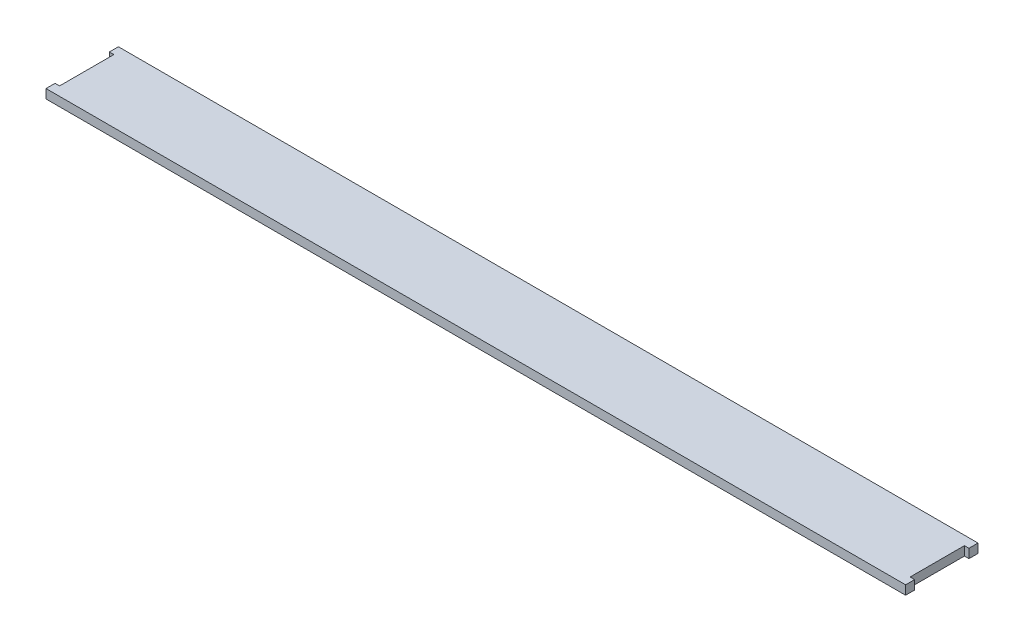
ISO-10303-21;
HEADER;
FILE_DESCRIPTION(('STEP AP214'),'2;1');
FILE_NAME('part.step','',(''),(''),'','','');
FILE_SCHEMA(('AUTOMOTIVE_DESIGN { 1 0 10303 214 1 1 1 1 }'));
ENDSEC;
DATA;
#1=APPLICATION_CONTEXT('core data for automotive mechanical design processes');
#2=APPLICATION_PROTOCOL_DEFINITION('international standard','automotive_design',2000,#1);
#3=PRODUCT_CONTEXT('',#1,'mechanical');
#4=PRODUCT('Part','Part','',(#3));
#5=PRODUCT_RELATED_PRODUCT_CATEGORY('part','',(#4));
#6=PRODUCT_DEFINITION_FORMATION('','',#4);
#7=PRODUCT_DEFINITION_CONTEXT('part definition',#1,'design');
#8=PRODUCT_DEFINITION('design','',#6,#7);
#9=PRODUCT_DEFINITION_SHAPE('','',#8);
#10=(LENGTH_UNIT() NAMED_UNIT(*) SI_UNIT(.MILLI.,.METRE.));
#11=(NAMED_UNIT(*) PLANE_ANGLE_UNIT() SI_UNIT($,.RADIAN.));
#12=(NAMED_UNIT(*) SI_UNIT($,.STERADIAN.) SOLID_ANGLE_UNIT());
#13=UNCERTAINTY_MEASURE_WITH_UNIT(LENGTH_MEASURE(1.E-05),#10,'distance_accuracy_value','');
#14=(GEOMETRIC_REPRESENTATION_CONTEXT(3) GLOBAL_UNCERTAINTY_ASSIGNED_CONTEXT((#13)) GLOBAL_UNIT_ASSIGNED_CONTEXT((#10,
#11,#12)) REPRESENTATION_CONTEXT('',''));
#15=CARTESIAN_POINT('',(0.,0.,0.));
#16=DIRECTION('',(0.,0.,1.));
#17=DIRECTION('',(1.,0.,0.));
#18=AXIS2_PLACEMENT_3D('',#15,#16,#17);
#19=CARTESIAN_POINT('',(301.625,6.35,-28.1614592723087));
#20=DIRECTION('',(-1.,0.,0.));
#21=DIRECTION('',(0.,0.,1.));
#22=AXIS2_PLACEMENT_3D('',#19,#20,#21);
#23=PLANE('',#22);
#24=DIRECTION('',(0.,0.,-1.));
#25=VECTOR('',#24,1.);
#26=CARTESIAN_POINT('',(301.625,0.,-28.1614592723087));
#27=LINE('',#26,#25);
#28=CARTESIAN_POINT('',(301.625,0.,-21.8114592723087));
#29=VERTEX_POINT('',#28);
#30=CARTESIAN_POINT('',(301.625,0.,-28.1614592723087));
#31=VERTEX_POINT('',#30);
#32=EDGE_CURVE('E152',#29,#31,#27,.T.);
#33=ORIENTED_EDGE('',*,*,#32,.T.);
#34=DIRECTION('',(0.,-1.,0.));
#35=VECTOR('',#34,1.);
#36=CARTESIAN_POINT('',(301.625,6.35,-28.1614592723087));
#37=LINE('',#36,#35);
#38=CARTESIAN_POINT('',(301.625,6.35,-28.1614592723087));
#39=VERTEX_POINT('',#38);
#40=EDGE_CURVE('E11',#39,#31,#37,.T.);
#41=ORIENTED_EDGE('',*,*,#40,.F.);
#42=DIRECTION('',(0.,0.,-1.));
#43=VECTOR('',#42,1.);
#44=CARTESIAN_POINT('',(301.625,6.35,-28.1614592723087));
#45=LINE('',#44,#43);
#46=CARTESIAN_POINT('',(301.625,6.35,-21.8114592723087));
#47=VERTEX_POINT('',#46);
#48=EDGE_CURVE('E174',#47,#39,#45,.T.);
#49=ORIENTED_EDGE('',*,*,#48,.F.);
#50=DIRECTION('',(0.,-1.,0.));
#51=VECTOR('',#50,1.);
#52=CARTESIAN_POINT('',(301.625,6.35,-21.8114592723087));
#53=LINE('',#52,#51);
#54=EDGE_CURVE('E148',#47,#29,#53,.T.);
#55=ORIENTED_EDGE('',*,*,#54,.T.);
#56=EDGE_LOOP('',(#33,#41,#49,#55));
#57=FACE_BOUND('',#56,.T.);
#58=ADVANCED_FACE('F32',(#57),#23,.F.);
#59=CARTESIAN_POINT('',(301.625,6.35,-28.1614592723087));
#60=DIRECTION('',(0.,0.,1.));
#61=DIRECTION('',(1.,0.,0.));
#62=AXIS2_PLACEMENT_3D('',#59,#60,#61);
#63=PLANE('',#62);
#64=DIRECTION('',(-1.,0.,0.));
#65=VECTOR('',#64,1.);
#66=CARTESIAN_POINT('',(301.625,0.,-28.1614592723087));
#67=LINE('',#66,#65);
#68=CARTESIAN_POINT('',(-301.625,0.,-28.1614592723086));
#69=VERTEX_POINT('',#68);
#70=EDGE_CURVE('E155',#31,#69,#67,.T.);
#71=ORIENTED_EDGE('',*,*,#70,.T.);
#72=DIRECTION('',(0.,-1.,0.));
#73=VECTOR('',#72,1.);
#74=CARTESIAN_POINT('',(-301.625,6.35,-28.1614592723086));
#75=LINE('',#74,#73);
#76=CARTESIAN_POINT('',(-301.625,6.35,-28.1614592723086));
#77=VERTEX_POINT('',#76);
#78=EDGE_CURVE('E40',#77,#69,#75,.T.);
#79=ORIENTED_EDGE('',*,*,#78,.F.);
#80=DIRECTION('',(-1.,0.,0.));
#81=VECTOR('',#80,1.);
#82=CARTESIAN_POINT('',(301.625,6.35,-28.1614592723087));
#83=LINE('',#82,#81);
#84=EDGE_CURVE('E103',#39,#77,#83,.T.);
#85=ORIENTED_EDGE('',*,*,#84,.F.);
#86=ORIENTED_EDGE('',*,*,#40,.T.);
#87=EDGE_LOOP('',(#71,#79,#85,#86));
#88=FACE_BOUND('',#87,.T.);
#89=ADVANCED_FACE('F252',(#88),#63,.F.);
#90=CARTESIAN_POINT('',(-301.625,6.35,-28.1614592723086));
#91=DIRECTION('',(1.,0.,0.));
#92=DIRECTION('',(0.,0.,-1.));
#93=AXIS2_PLACEMENT_3D('',#90,#91,#92);
#94=PLANE('',#93);
#95=DIRECTION('',(0.,0.,1.));
#96=VECTOR('',#95,1.);
#97=CARTESIAN_POINT('',(-301.625,0.,-28.1614592723086));
#98=LINE('',#97,#96);
#99=CARTESIAN_POINT('',(-301.625,0.,-21.8114592723086));
#100=VERTEX_POINT('',#99);
#101=EDGE_CURVE('E157',#69,#100,#98,.T.);
#102=ORIENTED_EDGE('',*,*,#101,.T.);
#103=DIRECTION('',(0.,-1.,0.));
#104=VECTOR('',#103,1.);
#105=CARTESIAN_POINT('',(-301.625,6.35,-21.8114592723086));
#106=LINE('',#105,#104);
#107=CARTESIAN_POINT('',(-301.625,6.35,-21.8114592723086));
#108=VERTEX_POINT('',#107);
#109=EDGE_CURVE('E193',#108,#100,#106,.T.);
#110=ORIENTED_EDGE('',*,*,#109,.F.);
#111=DIRECTION('',(0.,0.,1.));
#112=VECTOR('',#111,1.);
#113=CARTESIAN_POINT('',(-301.625,6.35,-28.1614592723086));
#114=LINE('',#113,#112);
#115=EDGE_CURVE('E201',#77,#108,#114,.T.);
#116=ORIENTED_EDGE('',*,*,#115,.F.);
#117=ORIENTED_EDGE('',*,*,#78,.T.);
#118=EDGE_LOOP('',(#102,#110,#116,#117));
#119=FACE_BOUND('',#118,.T.);
#120=ADVANCED_FACE('F199',(#119),#94,.F.);
#121=CARTESIAN_POINT('',(-301.625,6.35,-21.8114592723086));
#122=DIRECTION('',(0.,0.,-1.));
#123=DIRECTION('',(-1.,0.,0.));
#124=AXIS2_PLACEMENT_3D('',#121,#122,#123);
#125=PLANE('',#124);
#126=DIRECTION('',(1.,0.,0.));
#127=VECTOR('',#126,1.);
#128=CARTESIAN_POINT('',(-301.625,0.,-21.8114592723086));
#129=LINE('',#128,#127);
#130=CARTESIAN_POINT('',(-298.45,0.,-21.8114592723086));
#131=VERTEX_POINT('',#130);
#132=EDGE_CURVE('E159',#100,#131,#129,.T.);
#133=ORIENTED_EDGE('',*,*,#132,.T.);
#134=DIRECTION('',(0.,-1.,0.));
#135=VECTOR('',#134,1.);
#136=CARTESIAN_POINT('',(-298.45,6.35,-21.8114592723086));
#137=LINE('',#136,#135);
#138=CARTESIAN_POINT('',(-298.45,6.35,-21.8114592723086));
#139=VERTEX_POINT('',#138);
#140=EDGE_CURVE('E190',#139,#131,#137,.T.);
#141=ORIENTED_EDGE('',*,*,#140,.F.);
#142=DIRECTION('',(1.,0.,0.));
#143=VECTOR('',#142,1.);
#144=CARTESIAN_POINT('',(-301.625,6.35,-21.8114592723086));
#145=LINE('',#144,#143);
#146=EDGE_CURVE('E219',#108,#139,#145,.T.);
#147=ORIENTED_EDGE('',*,*,#146,.F.);
#148=ORIENTED_EDGE('',*,*,#109,.T.);
#149=EDGE_LOOP('',(#133,#141,#147,#148));
#150=FACE_BOUND('',#149,.T.);
#151=ADVANCED_FACE('F210',(#150),#125,.F.);
#152=CARTESIAN_POINT('',(-298.45,6.35,-21.8114592723086));
#153=DIRECTION('',(1.,0.,0.));
#154=DIRECTION('',(0.,0.,-1.));
#155=AXIS2_PLACEMENT_3D('',#152,#153,#154);
#156=PLANE('',#155);
#157=DIRECTION('',(0.,0.,1.));
#158=VECTOR('',#157,1.);
#159=CARTESIAN_POINT('',(-298.45,0.,-21.8114592723086));
#160=LINE('',#159,#158);
#161=CARTESIAN_POINT('',(-298.45,0.,16.2885407276913));
#162=VERTEX_POINT('',#161);
#163=EDGE_CURVE('E161',#131,#162,#160,.T.);
#164=ORIENTED_EDGE('',*,*,#163,.T.);
#165=DIRECTION('',(0.,-1.,0.));
#166=VECTOR('',#165,1.);
#167=CARTESIAN_POINT('',(-298.45,6.35,16.2885407276913));
#168=LINE('',#167,#166);
#169=CARTESIAN_POINT('',(-298.45,6.35,16.2885407276913));
#170=VERTEX_POINT('',#169);
#171=EDGE_CURVE('E187',#170,#162,#168,.T.);
#172=ORIENTED_EDGE('',*,*,#171,.F.);
#173=DIRECTION('',(0.,0.,1.));
#174=VECTOR('',#173,1.);
#175=CARTESIAN_POINT('',(-298.45,6.35,-21.8114592723086));
#176=LINE('',#175,#174);
#177=EDGE_CURVE('E216',#139,#170,#176,.T.);
#178=ORIENTED_EDGE('',*,*,#177,.F.);
#179=ORIENTED_EDGE('',*,*,#140,.T.);
#180=EDGE_LOOP('',(#164,#172,#178,#179));
#181=FACE_BOUND('',#180,.T.);
#182=ADVANCED_FACE('F214',(#181),#156,.F.);
#183=CARTESIAN_POINT('',(-301.625,6.35,16.2885407276913));
#184=DIRECTION('',(0.,0.,1.));
#185=DIRECTION('',(1.,0.,0.));
#186=AXIS2_PLACEMENT_3D('',#183,#184,#185);
#187=PLANE('',#186);
#188=DIRECTION('',(-1.,0.,0.));
#189=VECTOR('',#188,1.);
#190=CARTESIAN_POINT('',(-301.625,0.,16.2885407276913));
#191=LINE('',#190,#189);
#192=CARTESIAN_POINT('',(-301.625,0.,16.2885407276913));
#193=VERTEX_POINT('',#192);
#194=EDGE_CURVE('E163',#162,#193,#191,.T.);
#195=ORIENTED_EDGE('',*,*,#194,.T.);
#196=DIRECTION('',(0.,-1.,0.));
#197=VECTOR('',#196,1.);
#198=CARTESIAN_POINT('',(-301.625,6.35,16.2885407276913));
#199=LINE('',#198,#197);
#200=CARTESIAN_POINT('',(-301.625,6.35,16.2885407276913));
#201=VERTEX_POINT('',#200);
#202=EDGE_CURVE('E184',#201,#193,#199,.T.);
#203=ORIENTED_EDGE('',*,*,#202,.F.);
#204=DIRECTION('',(-1.,0.,0.));
#205=VECTOR('',#204,1.);
#206=CARTESIAN_POINT('',(-301.625,6.35,16.2885407276913));
#207=LINE('',#206,#205);
#208=EDGE_CURVE('E218',#170,#201,#207,.T.);
#209=ORIENTED_EDGE('',*,*,#208,.F.);
#210=ORIENTED_EDGE('',*,*,#171,.T.);
#211=EDGE_LOOP('',(#195,#203,#209,#210));
#212=FACE_BOUND('',#211,.T.);
#213=ADVANCED_FACE('F265',(#212),#187,.F.);
#214=CARTESIAN_POINT('',(-301.625,6.35,16.2885407276913));
#215=DIRECTION('',(1.,0.,0.));
#216=DIRECTION('',(0.,0.,-1.));
#217=AXIS2_PLACEMENT_3D('',#214,#215,#216);
#218=PLANE('',#217);
#219=DIRECTION('',(0.,0.,1.));
#220=VECTOR('',#219,1.);
#221=CARTESIAN_POINT('',(-301.625,0.,16.2885407276913));
#222=LINE('',#221,#220);
#223=CARTESIAN_POINT('',(-301.625,0.,22.6385407276913));
#224=VERTEX_POINT('',#223);
#225=EDGE_CURVE('E165',#193,#224,#222,.T.);
#226=ORIENTED_EDGE('',*,*,#225,.T.);
#227=DIRECTION('',(0.,-1.,0.));
#228=VECTOR('',#227,1.);
#229=CARTESIAN_POINT('',(-301.625,6.35,22.6385407276913));
#230=LINE('',#229,#228);
#231=CARTESIAN_POINT('',(-301.625,6.35,22.6385407276913));
#232=VERTEX_POINT('',#231);
#233=EDGE_CURVE('E181',#232,#224,#230,.T.);
#234=ORIENTED_EDGE('',*,*,#233,.F.);
#235=DIRECTION('',(0.,0.,1.));
#236=VECTOR('',#235,1.);
#237=CARTESIAN_POINT('',(-301.625,6.35,16.2885407276913));
#238=LINE('',#237,#236);
#239=EDGE_CURVE('E221',#201,#232,#238,.T.);
#240=ORIENTED_EDGE('',*,*,#239,.F.);
#241=ORIENTED_EDGE('',*,*,#202,.T.);
#242=EDGE_LOOP('',(#226,#234,#240,#241));
#243=FACE_BOUND('',#242,.T.);
#244=ADVANCED_FACE('F268',(#243),#218,.F.);
#245=CARTESIAN_POINT('',(301.625,6.35,22.6385407276913));
#246=DIRECTION('',(0.,0.,-1.));
#247=DIRECTION('',(-1.,0.,0.));
#248=AXIS2_PLACEMENT_3D('',#245,#246,#247);
#249=PLANE('',#248);
#250=DIRECTION('',(1.,0.,0.));
#251=VECTOR('',#250,1.);
#252=CARTESIAN_POINT('',(301.625,0.,22.6385407276913));
#253=LINE('',#252,#251);
#254=CARTESIAN_POINT('',(301.625,0.,22.6385407276913));
#255=VERTEX_POINT('',#254);
#256=EDGE_CURVE('E167',#224,#255,#253,.T.);
#257=ORIENTED_EDGE('',*,*,#256,.T.);
#258=DIRECTION('',(0.,-1.,0.));
#259=VECTOR('',#258,1.);
#260=CARTESIAN_POINT('',(301.625,6.35,22.6385407276913));
#261=LINE('',#260,#259);
#262=CARTESIAN_POINT('',(301.625,6.35,22.6385407276913));
#263=VERTEX_POINT('',#262);
#264=EDGE_CURVE('E178',#263,#255,#261,.T.);
#265=ORIENTED_EDGE('',*,*,#264,.F.);
#266=DIRECTION('',(1.,0.,0.));
#267=VECTOR('',#266,1.);
#268=CARTESIAN_POINT('',(301.625,6.35,22.6385407276913));
#269=LINE('',#268,#267);
#270=EDGE_CURVE('E227',#232,#263,#269,.T.);
#271=ORIENTED_EDGE('',*,*,#270,.F.);
#272=ORIENTED_EDGE('',*,*,#233,.T.);
#273=EDGE_LOOP('',(#257,#265,#271,#272));
#274=FACE_BOUND('',#273,.T.);
#275=ADVANCED_FACE('F233',(#274),#249,.F.);
#276=CARTESIAN_POINT('',(301.625,6.35,16.2885407276913));
#277=DIRECTION('',(-1.,0.,0.));
#278=DIRECTION('',(0.,0.,1.));
#279=AXIS2_PLACEMENT_3D('',#276,#277,#278);
#280=PLANE('',#279);
#281=DIRECTION('',(0.,0.,-1.));
#282=VECTOR('',#281,1.);
#283=CARTESIAN_POINT('',(301.625,0.,16.2885407276913));
#284=LINE('',#283,#282);
#285=CARTESIAN_POINT('',(301.625,0.,16.2885407276913));
#286=VERTEX_POINT('',#285);
#287=EDGE_CURVE('E169',#255,#286,#284,.T.);
#288=ORIENTED_EDGE('',*,*,#287,.T.);
#289=DIRECTION('',(0.,-1.,0.));
#290=VECTOR('',#289,1.);
#291=CARTESIAN_POINT('',(301.625,6.35,16.2885407276913));
#292=LINE('',#291,#290);
#293=CARTESIAN_POINT('',(301.625,6.35,16.2885407276913));
#294=VERTEX_POINT('',#293);
#295=EDGE_CURVE('E143',#294,#286,#292,.T.);
#296=ORIENTED_EDGE('',*,*,#295,.F.);
#297=DIRECTION('',(0.,0.,-1.));
#298=VECTOR('',#297,1.);
#299=CARTESIAN_POINT('',(301.625,6.35,16.2885407276913));
#300=LINE('',#299,#298);
#301=EDGE_CURVE('E134',#263,#294,#300,.T.);
#302=ORIENTED_EDGE('',*,*,#301,.F.);
#303=ORIENTED_EDGE('',*,*,#264,.T.);
#304=EDGE_LOOP('',(#288,#296,#302,#303));
#305=FACE_BOUND('',#304,.T.);
#306=ADVANCED_FACE('F237',(#305),#280,.F.);
#307=CARTESIAN_POINT('',(301.625,6.35,16.2885407276913));
#308=DIRECTION('',(0.,0.,1.));
#309=DIRECTION('',(1.,0.,0.));
#310=AXIS2_PLACEMENT_3D('',#307,#308,#309);
#311=PLANE('',#310);
#312=DIRECTION('',(-1.,0.,0.));
#313=VECTOR('',#312,1.);
#314=CARTESIAN_POINT('',(301.625,0.,16.2885407276913));
#315=LINE('',#314,#313);
#316=CARTESIAN_POINT('',(298.45,0.,16.2885407276913));
#317=VERTEX_POINT('',#316);
#318=EDGE_CURVE('E142',#286,#317,#315,.T.);
#319=ORIENTED_EDGE('',*,*,#318,.T.);
#320=DIRECTION('',(0.,-1.,0.));
#321=VECTOR('',#320,1.);
#322=CARTESIAN_POINT('',(298.45,6.35,16.2885407276913));
#323=LINE('',#322,#321);
#324=CARTESIAN_POINT('',(298.45,6.35,16.2885407276913));
#325=VERTEX_POINT('',#324);
#326=EDGE_CURVE('E139',#325,#317,#323,.T.);
#327=ORIENTED_EDGE('',*,*,#326,.F.);
#328=DIRECTION('',(-1.,0.,0.));
#329=VECTOR('',#328,1.);
#330=CARTESIAN_POINT('',(301.625,6.35,16.2885407276913));
#331=LINE('',#330,#329);
#332=EDGE_CURVE('E128',#294,#325,#331,.T.);
#333=ORIENTED_EDGE('',*,*,#332,.F.);
#334=ORIENTED_EDGE('',*,*,#295,.T.);
#335=EDGE_LOOP('',(#319,#327,#333,#334));
#336=FACE_BOUND('',#335,.T.);
#337=ADVANCED_FACE('F140',(#336),#311,.F.);
#338=CARTESIAN_POINT('',(298.45,6.35,-21.8114592723087));
#339=DIRECTION('',(-1.,0.,0.));
#340=DIRECTION('',(0.,0.,1.));
#341=AXIS2_PLACEMENT_3D('',#338,#339,#340);
#342=PLANE('',#341);
#343=DIRECTION('',(0.,0.,-1.));
#344=VECTOR('',#343,1.);
#345=CARTESIAN_POINT('',(298.45,0.,-21.8114592723087));
#346=LINE('',#345,#344);
#347=CARTESIAN_POINT('',(298.45,0.,-21.8114592723087));
#348=VERTEX_POINT('',#347);
#349=EDGE_CURVE('E89',#317,#348,#346,.T.);
#350=ORIENTED_EDGE('',*,*,#349,.T.);
#351=DIRECTION('',(0.,-1.,0.));
#352=VECTOR('',#351,1.);
#353=CARTESIAN_POINT('',(298.45,6.35,-21.8114592723087));
#354=LINE('',#353,#352);
#355=CARTESIAN_POINT('',(298.45,6.35,-21.8114592723087));
#356=VERTEX_POINT('',#355);
#357=EDGE_CURVE('E144',#356,#348,#354,.T.);
#358=ORIENTED_EDGE('',*,*,#357,.F.);
#359=DIRECTION('',(0.,0.,-1.));
#360=VECTOR('',#359,1.);
#361=CARTESIAN_POINT('',(298.45,6.35,-21.8114592723087));
#362=LINE('',#361,#360);
#363=EDGE_CURVE('E132',#325,#356,#362,.T.);
#364=ORIENTED_EDGE('',*,*,#363,.F.);
#365=ORIENTED_EDGE('',*,*,#326,.T.);
#366=EDGE_LOOP('',(#350,#358,#364,#365));
#367=FACE_BOUND('',#366,.T.);
#368=ADVANCED_FACE('F146',(#367),#342,.F.);
#369=CARTESIAN_POINT('',(301.625,6.35,-21.8114592723087));
#370=DIRECTION('',(0.,0.,-1.));
#371=DIRECTION('',(-1.,0.,0.));
#372=AXIS2_PLACEMENT_3D('',#369,#370,#371);
#373=PLANE('',#372);
#374=DIRECTION('',(1.,0.,0.));
#375=VECTOR('',#374,1.);
#376=CARTESIAN_POINT('',(301.625,0.,-21.8114592723087));
#377=LINE('',#376,#375);
#378=EDGE_CURVE('E95',#348,#29,#377,.T.);
#379=ORIENTED_EDGE('',*,*,#378,.T.);
#380=ORIENTED_EDGE('',*,*,#54,.F.);
#381=DIRECTION('',(1.,0.,0.));
#382=VECTOR('',#381,1.);
#383=CARTESIAN_POINT('',(301.625,6.35,-21.8114592723087));
#384=LINE('',#383,#382);
#385=EDGE_CURVE('E48',#356,#47,#384,.T.);
#386=ORIENTED_EDGE('',*,*,#385,.F.);
#387=ORIENTED_EDGE('',*,*,#357,.T.);
#388=EDGE_LOOP('',(#379,#380,#386,#387));
#389=FACE_BOUND('',#388,.T.);
#390=ADVANCED_FACE('F241',(#389),#373,.F.);
#391=CARTESIAN_POINT('',(301.625,6.35,-21.8114592723087));
#392=DIRECTION('',(0.,-1.,0.));
#393=DIRECTION('',(0.,0.,-1.));
#394=AXIS2_PLACEMENT_3D('',#391,#392,#393);
#395=PLANE('',#394);
#396=ORIENTED_EDGE('',*,*,#48,.T.);
#397=ORIENTED_EDGE('',*,*,#84,.T.);
#398=ORIENTED_EDGE('',*,*,#115,.T.);
#399=ORIENTED_EDGE('',*,*,#146,.T.);
#400=ORIENTED_EDGE('',*,*,#177,.T.);
#401=ORIENTED_EDGE('',*,*,#208,.T.);
#402=ORIENTED_EDGE('',*,*,#239,.T.);
#403=ORIENTED_EDGE('',*,*,#270,.T.);
#404=ORIENTED_EDGE('',*,*,#301,.T.);
#405=ORIENTED_EDGE('',*,*,#332,.T.);
#406=ORIENTED_EDGE('',*,*,#363,.T.);
#407=ORIENTED_EDGE('',*,*,#385,.T.);
#408=EDGE_LOOP('',(#396,#397,#398,#399,#400,#401,#402,#403,#404,#405,#406,#407));
#409=FACE_BOUND('',#408,.T.);
#410=ADVANCED_FACE('F130',(#409),#395,.F.);
#411=CARTESIAN_POINT('',(301.625,0.,-21.8114592723087));
#412=DIRECTION('',(0.,-1.,0.));
#413=DIRECTION('',(0.,0.,-1.));
#414=AXIS2_PLACEMENT_3D('',#411,#412,#413);
#415=PLANE('',#414);
#416=ORIENTED_EDGE('',*,*,#32,.F.);
#417=ORIENTED_EDGE('',*,*,#378,.F.);
#418=ORIENTED_EDGE('',*,*,#349,.F.);
#419=ORIENTED_EDGE('',*,*,#318,.F.);
#420=ORIENTED_EDGE('',*,*,#287,.F.);
#421=ORIENTED_EDGE('',*,*,#256,.F.);
#422=ORIENTED_EDGE('',*,*,#225,.F.);
#423=ORIENTED_EDGE('',*,*,#194,.F.);
#424=ORIENTED_EDGE('',*,*,#163,.F.);
#425=ORIENTED_EDGE('',*,*,#132,.F.);
#426=ORIENTED_EDGE('',*,*,#101,.F.);
#427=ORIENTED_EDGE('',*,*,#70,.F.);
#428=EDGE_LOOP('',(#416,#417,#418,#419,#420,#421,#422,#423,#424,#425,#426,#427));
#429=FACE_BOUND('',#428,.T.);
#430=ADVANCED_FACE('F205',(#429),#415,.T.);
#431=CLOSED_SHELL('',(#58,#89,#120,#151,#182,#213,#244,#275,#306,#337,#368,#390,#410,#430));
#432=MANIFOLD_SOLID_BREP('B2',#431);
#433=ADVANCED_BREP_SHAPE_REPRESENTATION('',(#18,#432),#14);
#434=SHAPE_DEFINITION_REPRESENTATION(#9,#433);
ENDSEC;
END-ISO-10303-21;
